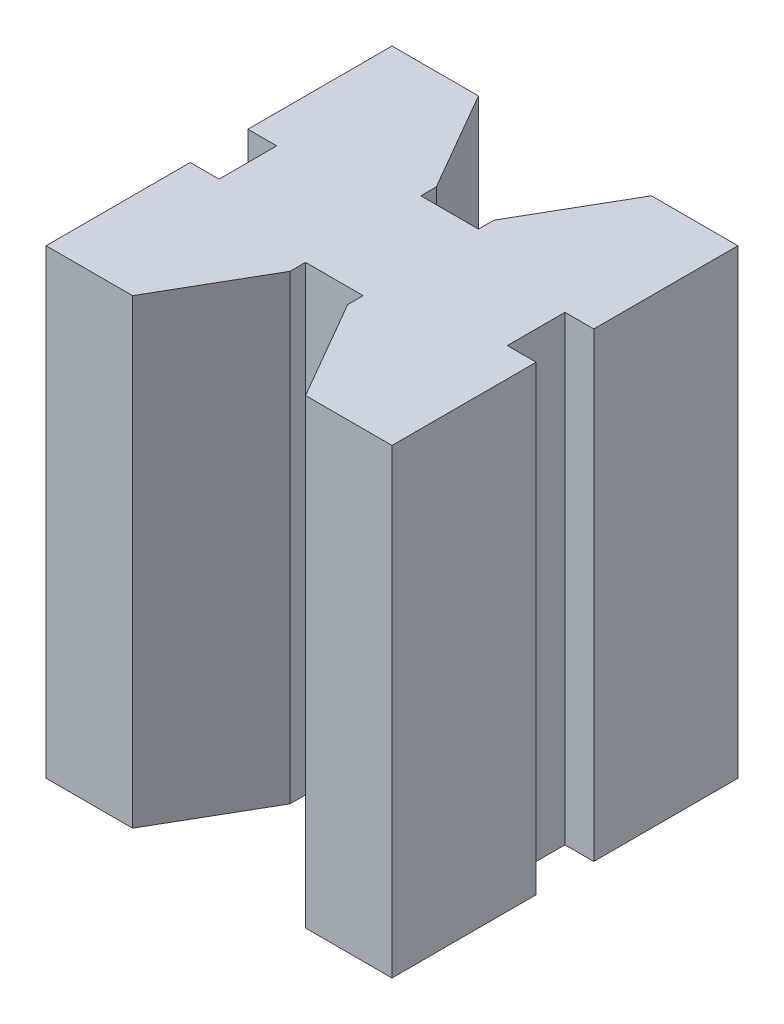
ISO-10303-21;
HEADER;
FILE_DESCRIPTION(('STEP AP214'),'2;1');
FILE_NAME('part.step','',(''),(''),'','','');
FILE_SCHEMA(('AUTOMOTIVE_DESIGN { 1 0 10303 214 1 1 1 1 }'));
ENDSEC;
DATA;
#1=APPLICATION_CONTEXT('core data for automotive mechanical design processes');
#2=APPLICATION_PROTOCOL_DEFINITION('international standard','automotive_design',2000,#1);
#3=PRODUCT_CONTEXT('',#1,'mechanical');
#4=PRODUCT('Part','Part','',(#3));
#5=PRODUCT_RELATED_PRODUCT_CATEGORY('part','',(#4));
#6=PRODUCT_DEFINITION_FORMATION('','',#4);
#7=PRODUCT_DEFINITION_CONTEXT('part definition',#1,'design');
#8=PRODUCT_DEFINITION('design','',#6,#7);
#9=PRODUCT_DEFINITION_SHAPE('','',#8);
#10=(LENGTH_UNIT() NAMED_UNIT(*) SI_UNIT(.MILLI.,.METRE.));
#11=(NAMED_UNIT(*) PLANE_ANGLE_UNIT() SI_UNIT($,.RADIAN.));
#12=(NAMED_UNIT(*) SI_UNIT($,.STERADIAN.) SOLID_ANGLE_UNIT());
#13=UNCERTAINTY_MEASURE_WITH_UNIT(LENGTH_MEASURE(1.E-05),#10,'distance_accuracy_value','');
#14=(GEOMETRIC_REPRESENTATION_CONTEXT(3) GLOBAL_UNCERTAINTY_ASSIGNED_CONTEXT((#13)) GLOBAL_UNIT_ASSIGNED_CONTEXT((#10,
#11,#12)) REPRESENTATION_CONTEXT('',''));
#15=CARTESIAN_POINT('',(0.,0.,0.));
#16=DIRECTION('',(0.,0.,1.));
#17=DIRECTION('',(1.,0.,0.));
#18=AXIS2_PLACEMENT_3D('',#15,#16,#17);
#19=CARTESIAN_POINT('',(0.,40.,12.5));
#20=DIRECTION('',(-1.,0.,0.));
#21=DIRECTION('',(0.,0.,1.));
#22=AXIS2_PLACEMENT_3D('',#19,#20,#21);
#23=PLANE('',#22);
#24=DIRECTION('',(0.,0.,-1.));
#25=VECTOR('',#24,1.);
#26=CARTESIAN_POINT('',(0.,0.,12.5));
#27=LINE('',#26,#25);
#28=CARTESIAN_POINT('',(0.,0.,12.5));
#29=VERTEX_POINT('',#28);
#30=CARTESIAN_POINT('',(0.,0.,0.));
#31=VERTEX_POINT('',#30);
#32=EDGE_CURVE('E233',#29,#31,#27,.T.);
#33=ORIENTED_EDGE('',*,*,#32,.T.);
#34=DIRECTION('',(0.,-1.,0.));
#35=VECTOR('',#34,1.);
#36=CARTESIAN_POINT('',(0.,40.,0.));
#37=LINE('',#36,#35);
#38=CARTESIAN_POINT('',(0.,40.,0.));
#39=VERTEX_POINT('',#38);
#40=EDGE_CURVE('E11',#39,#31,#37,.T.);
#41=ORIENTED_EDGE('',*,*,#40,.F.);
#42=DIRECTION('',(0.,0.,-1.));
#43=VECTOR('',#42,1.);
#44=CARTESIAN_POINT('',(0.,40.,12.5));
#45=LINE('',#44,#43);
#46=CARTESIAN_POINT('',(0.,40.,12.5));
#47=VERTEX_POINT('',#46);
#48=EDGE_CURVE('E279',#47,#39,#45,.T.);
#49=ORIENTED_EDGE('',*,*,#48,.F.);
#50=DIRECTION('',(0.,-1.,0.));
#51=VECTOR('',#50,1.);
#52=CARTESIAN_POINT('',(0.,40.,12.5));
#53=LINE('',#52,#51);
#54=EDGE_CURVE('E229',#47,#29,#53,.T.);
#55=ORIENTED_EDGE('',*,*,#54,.T.);
#56=EDGE_LOOP('',(#33,#41,#49,#55));
#57=FACE_BOUND('',#56,.T.);
#58=ADVANCED_FACE('F41',(#57),#23,.F.);
#59=CARTESIAN_POINT('',(-7.5,40.,0.));
#60=DIRECTION('',(0.,0.,1.));
#61=DIRECTION('',(1.,0.,0.));
#62=AXIS2_PLACEMENT_3D('',#59,#60,#61);
#63=PLANE('',#62);
#64=DIRECTION('',(-1.,0.,0.));
#65=VECTOR('',#64,1.);
#66=CARTESIAN_POINT('',(-7.5,0.,0.));
#67=LINE('',#66,#65);
#68=CARTESIAN_POINT('',(-7.5,0.,0.));
#69=VERTEX_POINT('',#68);
#70=EDGE_CURVE('E236',#31,#69,#67,.T.);
#71=ORIENTED_EDGE('',*,*,#70,.T.);
#72=DIRECTION('',(0.,-1.,0.));
#73=VECTOR('',#72,1.);
#74=CARTESIAN_POINT('',(-7.5,40.,0.));
#75=LINE('',#74,#73);
#76=CARTESIAN_POINT('',(-7.5,40.,0.));
#77=VERTEX_POINT('',#76);
#78=EDGE_CURVE('E49',#77,#69,#75,.T.);
#79=ORIENTED_EDGE('',*,*,#78,.F.);
#80=DIRECTION('',(-1.,0.,0.));
#81=VECTOR('',#80,1.);
#82=CARTESIAN_POINT('',(-7.5,40.,0.));
#83=LINE('',#82,#81);
#84=EDGE_CURVE('E148',#39,#77,#83,.T.);
#85=ORIENTED_EDGE('',*,*,#84,.F.);
#86=ORIENTED_EDGE('',*,*,#40,.T.);
#87=EDGE_LOOP('',(#71,#79,#85,#86));
#88=FACE_BOUND('',#87,.T.);
#89=ADVANCED_FACE('F417',(#88),#63,.F.);
#90=CARTESIAN_POINT('',(-12.5,40.,8.6602540378444));
#91=DIRECTION('',(0.866025403784439,0.,0.5));
#92=DIRECTION('',(0.5,0.,-0.866025403784439));
#93=AXIS2_PLACEMENT_3D('',#90,#91,#92);
#94=PLANE('',#93);
#95=DIRECTION('',(-0.5,0.,0.866025403784439));
#96=VECTOR('',#95,1.);
#97=CARTESIAN_POINT('',(-12.5,0.,8.6602540378444));
#98=LINE('',#97,#96);
#99=CARTESIAN_POINT('',(-12.5,0.,8.6602540378444));
#100=VERTEX_POINT('',#99);
#101=EDGE_CURVE('E238',#69,#100,#98,.T.);
#102=ORIENTED_EDGE('',*,*,#101,.T.);
#103=DIRECTION('',(0.,-1.,0.));
#104=VECTOR('',#103,1.);
#105=CARTESIAN_POINT('',(-12.5,40.,8.6602540378444));
#106=LINE('',#105,#104);
#107=CARTESIAN_POINT('',(-12.5,40.,8.6602540378444));
#108=VERTEX_POINT('',#107);
#109=EDGE_CURVE('E334',#108,#100,#106,.T.);
#110=ORIENTED_EDGE('',*,*,#109,.F.);
#111=DIRECTION('',(-0.5,0.,0.866025403784439));
#112=VECTOR('',#111,1.);
#113=CARTESIAN_POINT('',(-12.5,40.,8.6602540378444));
#114=LINE('',#113,#112);
#115=EDGE_CURVE('E342',#77,#108,#114,.T.);
#116=ORIENTED_EDGE('',*,*,#115,.F.);
#117=ORIENTED_EDGE('',*,*,#78,.T.);
#118=EDGE_LOOP('',(#102,#110,#116,#117));
#119=FACE_BOUND('',#118,.T.);
#120=ADVANCED_FACE('F340',(#119),#94,.F.);
#121=CARTESIAN_POINT('',(-12.5,40.,10.));
#122=DIRECTION('',(1.,0.,0.));
#123=DIRECTION('',(0.,0.,-1.));
#124=AXIS2_PLACEMENT_3D('',#121,#122,#123);
#125=PLANE('',#124);
#126=DIRECTION('',(0.,0.,1.));
#127=VECTOR('',#126,1.);
#128=CARTESIAN_POINT('',(-12.5,0.,10.));
#129=LINE('',#128,#127);
#130=CARTESIAN_POINT('',(-12.5,0.,10.));
#131=VERTEX_POINT('',#130);
#132=EDGE_CURVE('E240',#100,#131,#129,.T.);
#133=ORIENTED_EDGE('',*,*,#132,.T.);
#134=DIRECTION('',(0.,-1.,0.));
#135=VECTOR('',#134,1.);
#136=CARTESIAN_POINT('',(-12.5,40.,10.));
#137=LINE('',#136,#135);
#138=CARTESIAN_POINT('',(-12.5,40.,10.));
#139=VERTEX_POINT('',#138);
#140=EDGE_CURVE('E331',#139,#131,#137,.T.);
#141=ORIENTED_EDGE('',*,*,#140,.F.);
#142=DIRECTION('',(0.,0.,1.));
#143=VECTOR('',#142,1.);
#144=CARTESIAN_POINT('',(-12.5,40.,10.));
#145=LINE('',#144,#143);
#146=EDGE_CURVE('E360',#108,#139,#145,.T.);
#147=ORIENTED_EDGE('',*,*,#146,.F.);
#148=ORIENTED_EDGE('',*,*,#109,.T.);
#149=EDGE_LOOP('',(#133,#141,#147,#148));
#150=FACE_BOUND('',#149,.T.);
#151=ADVANCED_FACE('F351',(#150),#125,.F.);
#152=CARTESIAN_POINT('',(-17.5,40.,10.));
#153=DIRECTION('',(0.,0.,1.));
#154=DIRECTION('',(1.,0.,0.));
#155=AXIS2_PLACEMENT_3D('',#152,#153,#154);
#156=PLANE('',#155);
#157=DIRECTION('',(-1.,0.,0.));
#158=VECTOR('',#157,1.);
#159=CARTESIAN_POINT('',(-17.5,0.,10.));
#160=LINE('',#159,#158);
#161=CARTESIAN_POINT('',(-17.5,0.,10.));
#162=VERTEX_POINT('',#161);
#163=EDGE_CURVE('E242',#131,#162,#160,.T.);
#164=ORIENTED_EDGE('',*,*,#163,.T.);
#165=DIRECTION('',(0.,-1.,0.));
#166=VECTOR('',#165,1.);
#167=CARTESIAN_POINT('',(-17.5,40.,10.));
#168=LINE('',#167,#166);
#169=CARTESIAN_POINT('',(-17.5,40.,10.));
#170=VERTEX_POINT('',#169);
#171=EDGE_CURVE('E328',#170,#162,#168,.T.);
#172=ORIENTED_EDGE('',*,*,#171,.F.);
#173=DIRECTION('',(-1.,0.,0.));
#174=VECTOR('',#173,1.);
#175=CARTESIAN_POINT('',(-17.5,40.,10.));
#176=LINE('',#175,#174);
#177=EDGE_CURVE('E357',#139,#170,#176,.T.);
#178=ORIENTED_EDGE('',*,*,#177,.F.);
#179=ORIENTED_EDGE('',*,*,#140,.T.);
#180=EDGE_LOOP('',(#164,#172,#178,#179));
#181=FACE_BOUND('',#180,.T.);
#182=ADVANCED_FACE('F355',(#181),#156,.F.);
#183=CARTESIAN_POINT('',(-17.5,40.,10.));
#184=DIRECTION('',(-1.,0.,0.));
#185=DIRECTION('',(0.,0.,1.));
#186=AXIS2_PLACEMENT_3D('',#183,#184,#185);
#187=PLANE('',#186);
#188=DIRECTION('',(0.,0.,-1.));
#189=VECTOR('',#188,1.);
#190=CARTESIAN_POINT('',(-17.5,0.,10.));
#191=LINE('',#190,#189);
#192=CARTESIAN_POINT('',(-17.5,0.,8.66025403784438));
#193=VERTEX_POINT('',#192);
#194=EDGE_CURVE('E244',#162,#193,#191,.T.);
#195=ORIENTED_EDGE('',*,*,#194,.T.);
#196=DIRECTION('',(0.,-1.,0.));
#197=VECTOR('',#196,1.);
#198=CARTESIAN_POINT('',(-17.5,40.,8.66025403784438));
#199=LINE('',#198,#197);
#200=CARTESIAN_POINT('',(-17.5,40.,8.66025403784438));
#201=VERTEX_POINT('',#200);
#202=EDGE_CURVE('E325',#201,#193,#199,.T.);
#203=ORIENTED_EDGE('',*,*,#202,.F.);
#204=DIRECTION('',(0.,0.,-1.));
#205=VECTOR('',#204,1.);
#206=CARTESIAN_POINT('',(-17.5,40.,10.));
#207=LINE('',#206,#205);
#208=EDGE_CURVE('E359',#170,#201,#207,.T.);
#209=ORIENTED_EDGE('',*,*,#208,.F.);
#210=ORIENTED_EDGE('',*,*,#171,.T.);
#211=EDGE_LOOP('',(#195,#203,#209,#210));
#212=FACE_BOUND('',#211,.T.);
#213=ADVANCED_FACE('F430',(#212),#187,.F.);
#214=CARTESIAN_POINT('',(-22.5,40.,0.));
#215=DIRECTION('',(-0.866025403784438,0.,0.5));
#216=DIRECTION('',(0.5,0.,0.866025403784439));
#217=AXIS2_PLACEMENT_3D('',#214,#215,#216);
#218=PLANE('',#217);
#219=DIRECTION('',(-0.5,0.,-0.866025403784438));
#220=VECTOR('',#219,1.);
#221=CARTESIAN_POINT('',(-22.5,0.,0.));
#222=LINE('',#221,#220);
#223=CARTESIAN_POINT('',(-22.5,0.,0.));
#224=VERTEX_POINT('',#223);
#225=EDGE_CURVE('E246',#193,#224,#222,.T.);
#226=ORIENTED_EDGE('',*,*,#225,.T.);
#227=DIRECTION('',(0.,-1.,0.));
#228=VECTOR('',#227,1.);
#229=CARTESIAN_POINT('',(-22.5,40.,0.));
#230=LINE('',#229,#228);
#231=CARTESIAN_POINT('',(-22.5,40.,0.));
#232=VERTEX_POINT('',#231);
#233=EDGE_CURVE('E322',#232,#224,#230,.T.);
#234=ORIENTED_EDGE('',*,*,#233,.F.);
#235=DIRECTION('',(-0.5,0.,-0.866025403784438));
#236=VECTOR('',#235,1.);
#237=CARTESIAN_POINT('',(-22.5,40.,0.));
#238=LINE('',#237,#236);
#239=EDGE_CURVE('E362',#201,#232,#238,.T.);
#240=ORIENTED_EDGE('',*,*,#239,.F.);
#241=ORIENTED_EDGE('',*,*,#202,.T.);
#242=EDGE_LOOP('',(#226,#234,#240,#241));
#243=FACE_BOUND('',#242,.T.);
#244=ADVANCED_FACE('F433',(#243),#218,.F.);
#245=CARTESIAN_POINT('',(-30.,40.,0.));
#246=DIRECTION('',(0.,0.,1.));
#247=DIRECTION('',(1.,0.,0.));
#248=AXIS2_PLACEMENT_3D('',#245,#246,#247);
#249=PLANE('',#248);
#250=DIRECTION('',(-1.,0.,0.));
#251=VECTOR('',#250,1.);
#252=CARTESIAN_POINT('',(-30.,0.,0.));
#253=LINE('',#252,#251);
#254=CARTESIAN_POINT('',(-30.,0.,0.));
#255=VERTEX_POINT('',#254);
#256=EDGE_CURVE('E248',#224,#255,#253,.T.);
#257=ORIENTED_EDGE('',*,*,#256,.T.);
#258=DIRECTION('',(0.,-1.,0.));
#259=VECTOR('',#258,1.);
#260=CARTESIAN_POINT('',(-30.,40.,0.));
#261=LINE('',#260,#259);
#262=CARTESIAN_POINT('',(-30.,40.,0.));
#263=VERTEX_POINT('',#262);
#264=EDGE_CURVE('E319',#263,#255,#261,.T.);
#265=ORIENTED_EDGE('',*,*,#264,.F.);
#266=DIRECTION('',(-1.,0.,0.));
#267=VECTOR('',#266,1.);
#268=CARTESIAN_POINT('',(-30.,40.,0.));
#269=LINE('',#268,#267);
#270=EDGE_CURVE('E368',#232,#263,#269,.T.);
#271=ORIENTED_EDGE('',*,*,#270,.F.);
#272=ORIENTED_EDGE('',*,*,#233,.T.);
#273=EDGE_LOOP('',(#257,#265,#271,#272));
#274=FACE_BOUND('',#273,.T.);
#275=ADVANCED_FACE('F437',(#274),#249,.F.);
#276=CARTESIAN_POINT('',(-30.,40.,0.));
#277=DIRECTION('',(1.,0.,0.));
#278=DIRECTION('',(0.,0.,-1.));
#279=AXIS2_PLACEMENT_3D('',#276,#277,#278);
#280=PLANE('',#279);
#281=DIRECTION('',(0.,0.,1.));
#282=VECTOR('',#281,1.);
#283=CARTESIAN_POINT('',(-30.,0.,0.));
#284=LINE('',#283,#282);
#285=CARTESIAN_POINT('',(-30.,0.,12.5));
#286=VERTEX_POINT('',#285);
#287=EDGE_CURVE('E250',#255,#286,#284,.T.);
#288=ORIENTED_EDGE('',*,*,#287,.T.);
#289=DIRECTION('',(0.,-1.,0.));
#290=VECTOR('',#289,1.);
#291=CARTESIAN_POINT('',(-30.,40.,12.5));
#292=LINE('',#291,#290);
#293=CARTESIAN_POINT('',(-30.,40.,12.5));
#294=VERTEX_POINT('',#293);
#295=EDGE_CURVE('E316',#294,#286,#292,.T.);
#296=ORIENTED_EDGE('',*,*,#295,.F.);
#297=DIRECTION('',(0.,0.,1.));
#298=VECTOR('',#297,1.);
#299=CARTESIAN_POINT('',(-30.,40.,0.));
#300=LINE('',#299,#298);
#301=EDGE_CURVE('E370',#263,#294,#300,.T.);
#302=ORIENTED_EDGE('',*,*,#301,.F.);
#303=ORIENTED_EDGE('',*,*,#264,.T.);
#304=EDGE_LOOP('',(#288,#296,#302,#303));
#305=FACE_BOUND('',#304,.T.);
#306=ADVANCED_FACE('F441',(#305),#280,.F.);
#307=CARTESIAN_POINT('',(-30.,40.,12.5));
#308=DIRECTION('',(0.,0.,-1.));
#309=DIRECTION('',(-1.,0.,0.));
#310=AXIS2_PLACEMENT_3D('',#307,#308,#309);
#311=PLANE('',#310);
#312=DIRECTION('',(1.,0.,0.));
#313=VECTOR('',#312,1.);
#314=CARTESIAN_POINT('',(-30.,0.,12.5));
#315=LINE('',#314,#313);
#316=CARTESIAN_POINT('',(-27.5,0.,12.5));
#317=VERTEX_POINT('',#316);
#318=EDGE_CURVE('E252',#286,#317,#315,.T.);
#319=ORIENTED_EDGE('',*,*,#318,.T.);
#320=DIRECTION('',(0.,-1.,0.));
#321=VECTOR('',#320,1.);
#322=CARTESIAN_POINT('',(-27.5,40.,12.5));
#323=LINE('',#322,#321);
#324=CARTESIAN_POINT('',(-27.5,40.,12.5));
#325=VERTEX_POINT('',#324);
#326=EDGE_CURVE('E313',#325,#317,#323,.T.);
#327=ORIENTED_EDGE('',*,*,#326,.F.);
#328=DIRECTION('',(1.,0.,0.));
#329=VECTOR('',#328,1.);
#330=CARTESIAN_POINT('',(-30.,40.,12.5));
#331=LINE('',#330,#329);
#332=EDGE_CURVE('E372',#294,#325,#331,.T.);
#333=ORIENTED_EDGE('',*,*,#332,.F.);
#334=ORIENTED_EDGE('',*,*,#295,.T.);
#335=EDGE_LOOP('',(#319,#327,#333,#334));
#336=FACE_BOUND('',#335,.T.);
#337=ADVANCED_FACE('F445',(#336),#311,.F.);
#338=CARTESIAN_POINT('',(-27.5,40.,12.5));
#339=DIRECTION('',(1.,0.,0.));
#340=DIRECTION('',(0.,0.,-1.));
#341=AXIS2_PLACEMENT_3D('',#338,#339,#340);
#342=PLANE('',#341);
#343=DIRECTION('',(0.,0.,1.));
#344=VECTOR('',#343,1.);
#345=CARTESIAN_POINT('',(-27.5,0.,12.5));
#346=LINE('',#345,#344);
#347=CARTESIAN_POINT('',(-27.5,0.,17.5));
#348=VERTEX_POINT('',#347);
#349=EDGE_CURVE('E254',#317,#348,#346,.T.);
#350=ORIENTED_EDGE('',*,*,#349,.T.);
#351=DIRECTION('',(0.,-1.,0.));
#352=VECTOR('',#351,1.);
#353=CARTESIAN_POINT('',(-27.5,40.,17.5));
#354=LINE('',#353,#352);
#355=CARTESIAN_POINT('',(-27.5,40.,17.5));
#356=VERTEX_POINT('',#355);
#357=EDGE_CURVE('E310',#356,#348,#354,.T.);
#358=ORIENTED_EDGE('',*,*,#357,.F.);
#359=DIRECTION('',(0.,0.,1.));
#360=VECTOR('',#359,1.);
#361=CARTESIAN_POINT('',(-27.5,40.,12.5));
#362=LINE('',#361,#360);
#363=EDGE_CURVE('E374',#325,#356,#362,.T.);
#364=ORIENTED_EDGE('',*,*,#363,.F.);
#365=ORIENTED_EDGE('',*,*,#326,.T.);
#366=EDGE_LOOP('',(#350,#358,#364,#365));
#367=FACE_BOUND('',#366,.T.);
#368=ADVANCED_FACE('F449',(#367),#342,.F.);
#369=CARTESIAN_POINT('',(-27.5,40.,17.5));
#370=DIRECTION('',(0.,0.,1.));
#371=DIRECTION('',(1.,0.,0.));
#372=AXIS2_PLACEMENT_3D('',#369,#370,#371);
#373=PLANE('',#372);
#374=DIRECTION('',(-1.,0.,0.));
#375=VECTOR('',#374,1.);
#376=CARTESIAN_POINT('',(-27.5,0.,17.5));
#377=LINE('',#376,#375);
#378=CARTESIAN_POINT('',(-30.,0.,17.5));
#379=VERTEX_POINT('',#378);
#380=EDGE_CURVE('E256',#348,#379,#377,.T.);
#381=ORIENTED_EDGE('',*,*,#380,.T.);
#382=DIRECTION('',(0.,-1.,0.));
#383=VECTOR('',#382,1.);
#384=CARTESIAN_POINT('',(-30.,40.,17.5));
#385=LINE('',#384,#383);
#386=CARTESIAN_POINT('',(-30.,40.,17.5));
#387=VERTEX_POINT('',#386);
#388=EDGE_CURVE('E307',#387,#379,#385,.T.);
#389=ORIENTED_EDGE('',*,*,#388,.F.);
#390=DIRECTION('',(-1.,0.,0.));
#391=VECTOR('',#390,1.);
#392=CARTESIAN_POINT('',(-27.5,40.,17.5));
#393=LINE('',#392,#391);
#394=EDGE_CURVE('E376',#356,#387,#393,.T.);
#395=ORIENTED_EDGE('',*,*,#394,.F.);
#396=ORIENTED_EDGE('',*,*,#357,.T.);
#397=EDGE_LOOP('',(#381,#389,#395,#396));
#398=FACE_BOUND('',#397,.T.);
#399=ADVANCED_FACE('F453',(#398),#373,.F.);
#400=CARTESIAN_POINT('',(-30.,40.,17.5));
#401=DIRECTION('',(1.,0.,0.));
#402=DIRECTION('',(0.,0.,-1.));
#403=AXIS2_PLACEMENT_3D('',#400,#401,#402);
#404=PLANE('',#403);
#405=DIRECTION('',(0.,0.,1.));
#406=VECTOR('',#405,1.);
#407=CARTESIAN_POINT('',(-30.,0.,17.5));
#408=LINE('',#407,#406);
#409=CARTESIAN_POINT('',(-30.,0.,30.));
#410=VERTEX_POINT('',#409);
#411=EDGE_CURVE('E258',#379,#410,#408,.T.);
#412=ORIENTED_EDGE('',*,*,#411,.T.);
#413=DIRECTION('',(0.,-1.,0.));
#414=VECTOR('',#413,1.);
#415=CARTESIAN_POINT('',(-30.,40.,30.));
#416=LINE('',#415,#414);
#417=CARTESIAN_POINT('',(-30.,40.,30.));
#418=VERTEX_POINT('',#417);
#419=EDGE_CURVE('E304',#418,#410,#416,.T.);
#420=ORIENTED_EDGE('',*,*,#419,.F.);
#421=DIRECTION('',(0.,0.,1.));
#422=VECTOR('',#421,1.);
#423=CARTESIAN_POINT('',(-30.,40.,17.5));
#424=LINE('',#423,#422);
#425=EDGE_CURVE('E378',#387,#418,#424,.T.);
#426=ORIENTED_EDGE('',*,*,#425,.F.);
#427=ORIENTED_EDGE('',*,*,#388,.T.);
#428=EDGE_LOOP('',(#412,#420,#426,#427));
#429=FACE_BOUND('',#428,.T.);
#430=ADVANCED_FACE('F457',(#429),#404,.F.);
#431=CARTESIAN_POINT('',(-30.,40.,30.));
#432=DIRECTION('',(0.,0.,-1.));
#433=DIRECTION('',(-1.,0.,0.));
#434=AXIS2_PLACEMENT_3D('',#431,#432,#433);
#435=PLANE('',#434);
#436=DIRECTION('',(1.,0.,0.));
#437=VECTOR('',#436,1.);
#438=CARTESIAN_POINT('',(-30.,0.,30.));
#439=LINE('',#438,#437);
#440=CARTESIAN_POINT('',(-22.5,0.,30.));
#441=VERTEX_POINT('',#440);
#442=EDGE_CURVE('E260',#410,#441,#439,.T.);
#443=ORIENTED_EDGE('',*,*,#442,.T.);
#444=DIRECTION('',(0.,-1.,0.));
#445=VECTOR('',#444,1.);
#446=CARTESIAN_POINT('',(-22.5,40.,30.));
#447=LINE('',#446,#445);
#448=CARTESIAN_POINT('',(-22.5,40.,30.));
#449=VERTEX_POINT('',#448);
#450=EDGE_CURVE('E301',#449,#441,#447,.T.);
#451=ORIENTED_EDGE('',*,*,#450,.F.);
#452=DIRECTION('',(1.,0.,0.));
#453=VECTOR('',#452,1.);
#454=CARTESIAN_POINT('',(-30.,40.,30.));
#455=LINE('',#454,#453);
#456=EDGE_CURVE('E380',#418,#449,#455,.T.);
#457=ORIENTED_EDGE('',*,*,#456,.F.);
#458=ORIENTED_EDGE('',*,*,#419,.T.);
#459=EDGE_LOOP('',(#443,#451,#457,#458));
#460=FACE_BOUND('',#459,.T.);
#461=ADVANCED_FACE('F461',(#460),#435,.F.);
#462=CARTESIAN_POINT('',(-17.5,40.,21.3397459621556));
#463=DIRECTION('',(-0.866025403784439,0.,-0.5));
#464=DIRECTION('',(-0.5,0.,0.866025403784439));
#465=AXIS2_PLACEMENT_3D('',#462,#463,#464);
#466=PLANE('',#465);
#467=DIRECTION('',(0.5,0.,-0.866025403784438));
#468=VECTOR('',#467,1.);
#469=CARTESIAN_POINT('',(-17.5,0.,21.3397459621556));
#470=LINE('',#469,#468);
#471=CARTESIAN_POINT('',(-17.5,0.,21.3397459621556));
#472=VERTEX_POINT('',#471);
#473=EDGE_CURVE('E262',#441,#472,#470,.T.);
#474=ORIENTED_EDGE('',*,*,#473,.T.);
#475=DIRECTION('',(0.,-1.,0.));
#476=VECTOR('',#475,1.);
#477=CARTESIAN_POINT('',(-17.5,40.,21.3397459621556));
#478=LINE('',#477,#476);
#479=CARTESIAN_POINT('',(-17.5,40.,21.3397459621556));
#480=VERTEX_POINT('',#479);
#481=EDGE_CURVE('E298',#480,#472,#478,.T.);
#482=ORIENTED_EDGE('',*,*,#481,.F.);
#483=DIRECTION('',(0.5,0.,-0.866025403784438));
#484=VECTOR('',#483,1.);
#485=CARTESIAN_POINT('',(-17.5,40.,21.3397459621556));
#486=LINE('',#485,#484);
#487=EDGE_CURVE('E382',#449,#480,#486,.T.);
#488=ORIENTED_EDGE('',*,*,#487,.F.);
#489=ORIENTED_EDGE('',*,*,#450,.T.);
#490=EDGE_LOOP('',(#474,#482,#488,#489));
#491=FACE_BOUND('',#490,.T.);
#492=ADVANCED_FACE('F465',(#491),#466,.F.);
#493=CARTESIAN_POINT('',(-17.5,40.,20.));
#494=DIRECTION('',(-1.,0.,0.));
#495=DIRECTION('',(0.,0.,1.));
#496=AXIS2_PLACEMENT_3D('',#493,#494,#495);
#497=PLANE('',#496);
#498=DIRECTION('',(0.,0.,-1.));
#499=VECTOR('',#498,1.);
#500=CARTESIAN_POINT('',(-17.5,0.,20.));
#501=LINE('',#500,#499);
#502=CARTESIAN_POINT('',(-17.5,0.,20.));
#503=VERTEX_POINT('',#502);
#504=EDGE_CURVE('E264',#472,#503,#501,.T.);
#505=ORIENTED_EDGE('',*,*,#504,.T.);
#506=DIRECTION('',(0.,-1.,0.));
#507=VECTOR('',#506,1.);
#508=CARTESIAN_POINT('',(-17.5,40.,20.));
#509=LINE('',#508,#507);
#510=CARTESIAN_POINT('',(-17.5,40.,20.));
#511=VERTEX_POINT('',#510);
#512=EDGE_CURVE('E295',#511,#503,#509,.T.);
#513=ORIENTED_EDGE('',*,*,#512,.F.);
#514=DIRECTION('',(0.,0.,-1.));
#515=VECTOR('',#514,1.);
#516=CARTESIAN_POINT('',(-17.5,40.,20.));
#517=LINE('',#516,#515);
#518=EDGE_CURVE('E384',#480,#511,#517,.T.);
#519=ORIENTED_EDGE('',*,*,#518,.F.);
#520=ORIENTED_EDGE('',*,*,#481,.T.);
#521=EDGE_LOOP('',(#505,#513,#519,#520));
#522=FACE_BOUND('',#521,.T.);
#523=ADVANCED_FACE('F469',(#522),#497,.F.);
#524=CARTESIAN_POINT('',(-17.5,40.,20.));
#525=DIRECTION('',(0.,0.,-1.));
#526=DIRECTION('',(-1.,0.,0.));
#527=AXIS2_PLACEMENT_3D('',#524,#525,#526);
#528=PLANE('',#527);
#529=DIRECTION('',(1.,0.,0.));
#530=VECTOR('',#529,1.);
#531=CARTESIAN_POINT('',(-17.5,0.,20.));
#532=LINE('',#531,#530);
#533=CARTESIAN_POINT('',(-12.5,0.,20.));
#534=VERTEX_POINT('',#533);
#535=EDGE_CURVE('E266',#503,#534,#532,.T.);
#536=ORIENTED_EDGE('',*,*,#535,.T.);
#537=DIRECTION('',(0.,-1.,0.));
#538=VECTOR('',#537,1.);
#539=CARTESIAN_POINT('',(-12.5,40.,20.));
#540=LINE('',#539,#538);
#541=CARTESIAN_POINT('',(-12.5,40.,20.));
#542=VERTEX_POINT('',#541);
#543=EDGE_CURVE('E292',#542,#534,#540,.T.);
#544=ORIENTED_EDGE('',*,*,#543,.F.);
#545=DIRECTION('',(1.,0.,0.));
#546=VECTOR('',#545,1.);
#547=CARTESIAN_POINT('',(-17.5,40.,20.));
#548=LINE('',#547,#546);
#549=EDGE_CURVE('E386',#511,#542,#548,.T.);
#550=ORIENTED_EDGE('',*,*,#549,.F.);
#551=ORIENTED_EDGE('',*,*,#512,.T.);
#552=EDGE_LOOP('',(#536,#544,#550,#551));
#553=FACE_BOUND('',#552,.T.);
#554=ADVANCED_FACE('F473',(#553),#528,.F.);
#555=CARTESIAN_POINT('',(-12.5,40.,20.));
#556=DIRECTION('',(1.,0.,0.));
#557=DIRECTION('',(0.,0.,-1.));
#558=AXIS2_PLACEMENT_3D('',#555,#556,#557);
#559=PLANE('',#558);
#560=DIRECTION('',(0.,0.,1.));
#561=VECTOR('',#560,1.);
#562=CARTESIAN_POINT('',(-12.5,0.,20.));
#563=LINE('',#562,#561);
#564=CARTESIAN_POINT('',(-12.5,0.,21.3397459621556));
#565=VERTEX_POINT('',#564);
#566=EDGE_CURVE('E268',#534,#565,#563,.T.);
#567=ORIENTED_EDGE('',*,*,#566,.T.);
#568=DIRECTION('',(0.,-1.,0.));
#569=VECTOR('',#568,1.);
#570=CARTESIAN_POINT('',(-12.5,40.,21.3397459621556));
#571=LINE('',#570,#569);
#572=CARTESIAN_POINT('',(-12.5,40.,21.3397459621556));
#573=VERTEX_POINT('',#572);
#574=EDGE_CURVE('E289',#573,#565,#571,.T.);
#575=ORIENTED_EDGE('',*,*,#574,.F.);
#576=DIRECTION('',(0.,0.,1.));
#577=VECTOR('',#576,1.);
#578=CARTESIAN_POINT('',(-12.5,40.,20.));
#579=LINE('',#578,#577);
#580=EDGE_CURVE('E388',#542,#573,#579,.T.);
#581=ORIENTED_EDGE('',*,*,#580,.F.);
#582=ORIENTED_EDGE('',*,*,#543,.T.);
#583=EDGE_LOOP('',(#567,#575,#581,#582));
#584=FACE_BOUND('',#583,.T.);
#585=ADVANCED_FACE('F477',(#584),#559,.F.);
#586=CARTESIAN_POINT('',(-7.5,40.,30.));
#587=DIRECTION('',(0.866025403784438,0.,-0.5));
#588=DIRECTION('',(-0.5,0.,-0.866025403784439));
#589=AXIS2_PLACEMENT_3D('',#586,#587,#588);
#590=PLANE('',#589);
#591=DIRECTION('',(0.5,0.,0.866025403784438));
#592=VECTOR('',#591,1.);
#593=CARTESIAN_POINT('',(-7.5,0.,30.));
#594=LINE('',#593,#592);
#595=CARTESIAN_POINT('',(-7.5,0.,30.));
#596=VERTEX_POINT('',#595);
#597=EDGE_CURVE('E270',#565,#596,#594,.T.);
#598=ORIENTED_EDGE('',*,*,#597,.T.);
#599=DIRECTION('',(0.,-1.,0.));
#600=VECTOR('',#599,1.);
#601=CARTESIAN_POINT('',(-7.5,40.,30.));
#602=LINE('',#601,#600);
#603=CARTESIAN_POINT('',(-7.5,40.,30.));
#604=VERTEX_POINT('',#603);
#605=EDGE_CURVE('E286',#604,#596,#602,.T.);
#606=ORIENTED_EDGE('',*,*,#605,.F.);
#607=DIRECTION('',(0.5,0.,0.866025403784438));
#608=VECTOR('',#607,1.);
#609=CARTESIAN_POINT('',(-7.5,40.,30.));
#610=LINE('',#609,#608);
#611=EDGE_CURVE('E390',#573,#604,#610,.T.);
#612=ORIENTED_EDGE('',*,*,#611,.F.);
#613=ORIENTED_EDGE('',*,*,#574,.T.);
#614=EDGE_LOOP('',(#598,#606,#612,#613));
#615=FACE_BOUND('',#614,.T.);
#616=ADVANCED_FACE('F481',(#615),#590,.F.);
#617=CARTESIAN_POINT('',(-7.5,40.,30.));
#618=DIRECTION('',(0.,0.,-1.));
#619=DIRECTION('',(-1.,0.,0.));
#620=AXIS2_PLACEMENT_3D('',#617,#618,#619);
#621=PLANE('',#620);
#622=DIRECTION('',(1.,0.,0.));
#623=VECTOR('',#622,1.);
#624=CARTESIAN_POINT('',(-7.5,0.,30.));
#625=LINE('',#624,#623);
#626=CARTESIAN_POINT('',(0.,0.,30.));
#627=VERTEX_POINT('',#626);
#628=EDGE_CURVE('E272',#596,#627,#625,.T.);
#629=ORIENTED_EDGE('',*,*,#628,.T.);
#630=DIRECTION('',(0.,-1.,0.));
#631=VECTOR('',#630,1.);
#632=CARTESIAN_POINT('',(0.,40.,30.));
#633=LINE('',#632,#631);
#634=CARTESIAN_POINT('',(0.,40.,30.));
#635=VERTEX_POINT('',#634);
#636=EDGE_CURVE('E283',#635,#627,#633,.T.);
#637=ORIENTED_EDGE('',*,*,#636,.F.);
#638=DIRECTION('',(1.,0.,0.));
#639=VECTOR('',#638,1.);
#640=CARTESIAN_POINT('',(-7.5,40.,30.));
#641=LINE('',#640,#639);
#642=EDGE_CURVE('E392',#604,#635,#641,.T.);
#643=ORIENTED_EDGE('',*,*,#642,.F.);
#644=ORIENTED_EDGE('',*,*,#605,.T.);
#645=EDGE_LOOP('',(#629,#637,#643,#644));
#646=FACE_BOUND('',#645,.T.);
#647=ADVANCED_FACE('F398',(#646),#621,.F.);
#648=CARTESIAN_POINT('',(0.,40.,17.5));
#649=DIRECTION('',(-1.,0.,0.));
#650=DIRECTION('',(0.,0.,1.));
#651=AXIS2_PLACEMENT_3D('',#648,#649,#650);
#652=PLANE('',#651);
#653=DIRECTION('',(0.,0.,-1.));
#654=VECTOR('',#653,1.);
#655=CARTESIAN_POINT('',(0.,0.,17.5));
#656=LINE('',#655,#654);
#657=CARTESIAN_POINT('',(0.,0.,17.5));
#658=VERTEX_POINT('',#657);
#659=EDGE_CURVE('E274',#627,#658,#656,.T.);
#660=ORIENTED_EDGE('',*,*,#659,.T.);
#661=DIRECTION('',(0.,-1.,0.));
#662=VECTOR('',#661,1.);
#663=CARTESIAN_POINT('',(0.,40.,17.5));
#664=LINE('',#663,#662);
#665=CARTESIAN_POINT('',(0.,40.,17.5));
#666=VERTEX_POINT('',#665);
#667=EDGE_CURVE('E224',#666,#658,#664,.T.);
#668=ORIENTED_EDGE('',*,*,#667,.F.);
#669=DIRECTION('',(0.,0.,-1.));
#670=VECTOR('',#669,1.);
#671=CARTESIAN_POINT('',(0.,40.,17.5));
#672=LINE('',#671,#670);
#673=EDGE_CURVE('E215',#635,#666,#672,.T.);
#674=ORIENTED_EDGE('',*,*,#673,.F.);
#675=ORIENTED_EDGE('',*,*,#636,.T.);
#676=EDGE_LOOP('',(#660,#668,#674,#675));
#677=FACE_BOUND('',#676,.T.);
#678=ADVANCED_FACE('F402',(#677),#652,.F.);
#679=CARTESIAN_POINT('',(-2.5,40.,17.5));
#680=DIRECTION('',(0.,0.,1.));
#681=DIRECTION('',(1.,0.,0.));
#682=AXIS2_PLACEMENT_3D('',#679,#680,#681);
#683=PLANE('',#682);
#684=DIRECTION('',(-1.,0.,0.));
#685=VECTOR('',#684,1.);
#686=CARTESIAN_POINT('',(-2.5,0.,17.5));
#687=LINE('',#686,#685);
#688=CARTESIAN_POINT('',(-2.5,0.,17.5));
#689=VERTEX_POINT('',#688);
#690=EDGE_CURVE('E223',#658,#689,#687,.T.);
#691=ORIENTED_EDGE('',*,*,#690,.T.);
#692=DIRECTION('',(0.,-1.,0.));
#693=VECTOR('',#692,1.);
#694=CARTESIAN_POINT('',(-2.5,40.,17.5));
#695=LINE('',#694,#693);
#696=CARTESIAN_POINT('',(-2.5,40.,17.5));
#697=VERTEX_POINT('',#696);
#698=EDGE_CURVE('E220',#697,#689,#695,.T.);
#699=ORIENTED_EDGE('',*,*,#698,.F.);
#700=DIRECTION('',(-1.,0.,0.));
#701=VECTOR('',#700,1.);
#702=CARTESIAN_POINT('',(-2.5,40.,17.5));
#703=LINE('',#702,#701);
#704=EDGE_CURVE('E209',#666,#697,#703,.T.);
#705=ORIENTED_EDGE('',*,*,#704,.F.);
#706=ORIENTED_EDGE('',*,*,#667,.T.);
#707=EDGE_LOOP('',(#691,#699,#705,#706));
#708=FACE_BOUND('',#707,.T.);
#709=ADVANCED_FACE('F221',(#708),#683,.F.);
#710=CARTESIAN_POINT('',(-2.5,40.,12.5));
#711=DIRECTION('',(-1.,0.,0.));
#712=DIRECTION('',(0.,0.,1.));
#713=AXIS2_PLACEMENT_3D('',#710,#711,#712);
#714=PLANE('',#713);
#715=DIRECTION('',(0.,0.,-1.));
#716=VECTOR('',#715,1.);
#717=CARTESIAN_POINT('',(-2.5,0.,12.5));
#718=LINE('',#717,#716);
#719=CARTESIAN_POINT('',(-2.5,0.,12.5));
#720=VERTEX_POINT('',#719);
#721=EDGE_CURVE('E134',#689,#720,#718,.T.);
#722=ORIENTED_EDGE('',*,*,#721,.T.);
#723=DIRECTION('',(0.,-1.,0.));
#724=VECTOR('',#723,1.);
#725=CARTESIAN_POINT('',(-2.5,40.,12.5));
#726=LINE('',#725,#724);
#727=CARTESIAN_POINT('',(-2.5,40.,12.5));
#728=VERTEX_POINT('',#727);
#729=EDGE_CURVE('E225',#728,#720,#726,.T.);
#730=ORIENTED_EDGE('',*,*,#729,.F.);
#731=DIRECTION('',(0.,0.,-1.));
#732=VECTOR('',#731,1.);
#733=CARTESIAN_POINT('',(-2.5,40.,12.5));
#734=LINE('',#733,#732);
#735=EDGE_CURVE('E213',#697,#728,#734,.T.);
#736=ORIENTED_EDGE('',*,*,#735,.F.);
#737=ORIENTED_EDGE('',*,*,#698,.T.);
#738=EDGE_LOOP('',(#722,#730,#736,#737));
#739=FACE_BOUND('',#738,.T.);
#740=ADVANCED_FACE('F227',(#739),#714,.F.);
#741=CARTESIAN_POINT('',(0.,40.,12.5));
#742=DIRECTION('',(0.,0.,-1.));
#743=DIRECTION('',(-1.,0.,0.));
#744=AXIS2_PLACEMENT_3D('',#741,#742,#743);
#745=PLANE('',#744);
#746=DIRECTION('',(1.,0.,0.));
#747=VECTOR('',#746,1.);
#748=CARTESIAN_POINT('',(0.,0.,12.5));
#749=LINE('',#748,#747);
#750=EDGE_CURVE('E140',#720,#29,#749,.T.);
#751=ORIENTED_EDGE('',*,*,#750,.T.);
#752=ORIENTED_EDGE('',*,*,#54,.F.);
#753=DIRECTION('',(1.,0.,0.));
#754=VECTOR('',#753,1.);
#755=CARTESIAN_POINT('',(0.,40.,12.5));
#756=LINE('',#755,#754);
#757=EDGE_CURVE('E57',#728,#47,#756,.T.);
#758=ORIENTED_EDGE('',*,*,#757,.F.);
#759=ORIENTED_EDGE('',*,*,#729,.T.);
#760=EDGE_LOOP('',(#751,#752,#758,#759));
#761=FACE_BOUND('',#760,.T.);
#762=ADVANCED_FACE('F406',(#761),#745,.F.);
#763=CARTESIAN_POINT('',(0.,40.,0.));
#764=DIRECTION('',(0.,-1.,0.));
#765=DIRECTION('',(0.,0.,-1.));
#766=AXIS2_PLACEMENT_3D('',#763,#764,#765);
#767=PLANE('',#766);
#768=ORIENTED_EDGE('',*,*,#48,.T.);
#769=ORIENTED_EDGE('',*,*,#84,.T.);
#770=ORIENTED_EDGE('',*,*,#115,.T.);
#771=ORIENTED_EDGE('',*,*,#146,.T.);
#772=ORIENTED_EDGE('',*,*,#177,.T.);
#773=ORIENTED_EDGE('',*,*,#208,.T.);
#774=ORIENTED_EDGE('',*,*,#239,.T.);
#775=ORIENTED_EDGE('',*,*,#270,.T.);
#776=ORIENTED_EDGE('',*,*,#301,.T.);
#777=ORIENTED_EDGE('',*,*,#332,.T.);
#778=ORIENTED_EDGE('',*,*,#363,.T.);
#779=ORIENTED_EDGE('',*,*,#394,.T.);
#780=ORIENTED_EDGE('',*,*,#425,.T.);
#781=ORIENTED_EDGE('',*,*,#456,.T.);
#782=ORIENTED_EDGE('',*,*,#487,.T.);
#783=ORIENTED_EDGE('',*,*,#518,.T.);
#784=ORIENTED_EDGE('',*,*,#549,.T.);
#785=ORIENTED_EDGE('',*,*,#580,.T.);
#786=ORIENTED_EDGE('',*,*,#611,.T.);
#787=ORIENTED_EDGE('',*,*,#642,.T.);
#788=ORIENTED_EDGE('',*,*,#673,.T.);
#789=ORIENTED_EDGE('',*,*,#704,.T.);
#790=ORIENTED_EDGE('',*,*,#735,.T.);
#791=ORIENTED_EDGE('',*,*,#757,.T.);
#792=EDGE_LOOP('',(#768,#769,#770,#771,#772,#773,#774,#775,#776,#777,#778,#779,#780,#781,#782,
#783,#784,#785,#786,#787,#788,#789,#790,#791));
#793=FACE_BOUND('',#792,.T.);
#794=ADVANCED_FACE('F211',(#793),#767,.F.);
#795=CARTESIAN_POINT('',(0.,0.,0.));
#796=DIRECTION('',(0.,-1.,0.));
#797=DIRECTION('',(0.,0.,-1.));
#798=AXIS2_PLACEMENT_3D('',#795,#796,#797);
#799=PLANE('',#798);
#800=ORIENTED_EDGE('',*,*,#32,.F.);
#801=ORIENTED_EDGE('',*,*,#750,.F.);
#802=ORIENTED_EDGE('',*,*,#721,.F.);
#803=ORIENTED_EDGE('',*,*,#690,.F.);
#804=ORIENTED_EDGE('',*,*,#659,.F.);
#805=ORIENTED_EDGE('',*,*,#628,.F.);
#806=ORIENTED_EDGE('',*,*,#597,.F.);
#807=ORIENTED_EDGE('',*,*,#566,.F.);
#808=ORIENTED_EDGE('',*,*,#535,.F.);
#809=ORIENTED_EDGE('',*,*,#504,.F.);
#810=ORIENTED_EDGE('',*,*,#473,.F.);
#811=ORIENTED_EDGE('',*,*,#442,.F.);
#812=ORIENTED_EDGE('',*,*,#411,.F.);
#813=ORIENTED_EDGE('',*,*,#380,.F.);
#814=ORIENTED_EDGE('',*,*,#349,.F.);
#815=ORIENTED_EDGE('',*,*,#318,.F.);
#816=ORIENTED_EDGE('',*,*,#287,.F.);
#817=ORIENTED_EDGE('',*,*,#256,.F.);
#818=ORIENTED_EDGE('',*,*,#225,.F.);
#819=ORIENTED_EDGE('',*,*,#194,.F.);
#820=ORIENTED_EDGE('',*,*,#163,.F.);
#821=ORIENTED_EDGE('',*,*,#132,.F.);
#822=ORIENTED_EDGE('',*,*,#101,.F.);
#823=ORIENTED_EDGE('',*,*,#70,.F.);
#824=EDGE_LOOP('',(#800,#801,#802,#803,#804,#805,#806,#807,#808,#809,#810,#811,#812,#813,#814,
#815,#816,#817,#818,#819,#820,#821,#822,#823));
#825=FACE_BOUND('',#824,.T.);
#826=ADVANCED_FACE('F346',(#825),#799,.T.);
#827=CLOSED_SHELL('',(#58,#89,#120,#151,#182,#213,#244,#275,#306,#337,#368,#399,#430,#461,#492,
#523,#554,#585,#616,#647,#678,#709,#740,#762,#794,#826));
#828=MANIFOLD_SOLID_BREP('B2',#827);
#829=ADVANCED_BREP_SHAPE_REPRESENTATION('',(#18,#828),#14);
#830=SHAPE_DEFINITION_REPRESENTATION(#9,#829);
ENDSEC;
END-ISO-10303-21;
